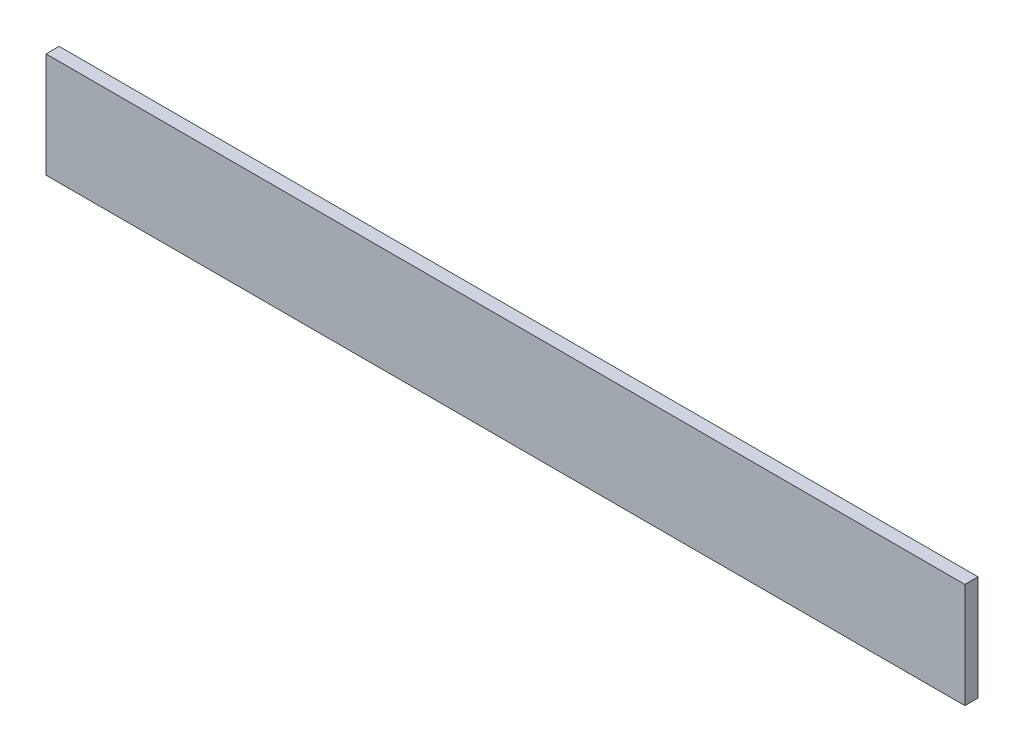
ISO-10303-21;
HEADER;
FILE_DESCRIPTION(('STEP AP214'),'2;1');
FILE_NAME('part.step','',(''),(''),'','','');
FILE_SCHEMA(('AUTOMOTIVE_DESIGN { 1 0 10303 214 1 1 1 1 }'));
ENDSEC;
DATA;
#1=APPLICATION_CONTEXT('core data for automotive mechanical design processes');
#2=APPLICATION_PROTOCOL_DEFINITION('international standard','automotive_design',2000,#1);
#3=PRODUCT_CONTEXT('',#1,'mechanical');
#4=PRODUCT('Part','Part','',(#3));
#5=PRODUCT_RELATED_PRODUCT_CATEGORY('part','',(#4));
#6=PRODUCT_DEFINITION_FORMATION('','',#4);
#7=PRODUCT_DEFINITION_CONTEXT('part definition',#1,'design');
#8=PRODUCT_DEFINITION('design','',#6,#7);
#9=PRODUCT_DEFINITION_SHAPE('','',#8);
#10=(LENGTH_UNIT() NAMED_UNIT(*) SI_UNIT(.MILLI.,.METRE.));
#11=(NAMED_UNIT(*) PLANE_ANGLE_UNIT() SI_UNIT($,.RADIAN.));
#12=(NAMED_UNIT(*) SI_UNIT($,.STERADIAN.) SOLID_ANGLE_UNIT());
#13=UNCERTAINTY_MEASURE_WITH_UNIT(LENGTH_MEASURE(1.E-05),#10,'distance_accuracy_value','');
#14=(GEOMETRIC_REPRESENTATION_CONTEXT(3) GLOBAL_UNCERTAINTY_ASSIGNED_CONTEXT((#13)) GLOBAL_UNIT_ASSIGNED_CONTEXT((#10,
#11,#12)) REPRESENTATION_CONTEXT('',''));
#15=CARTESIAN_POINT('',(0.,0.,0.));
#16=DIRECTION('',(0.,0.,1.));
#17=DIRECTION('',(1.,0.,0.));
#18=AXIS2_PLACEMENT_3D('',#15,#16,#17);
#19=CARTESIAN_POINT('',(175.,20.,5.));
#20=DIRECTION('',(-1.,0.,0.));
#21=DIRECTION('',(0.,0.,1.));
#22=AXIS2_PLACEMENT_3D('',#19,#20,#21);
#23=PLANE('',#22);
#24=DIRECTION('',(0.,1.,0.));
#25=VECTOR('',#24,1.);
#26=CARTESIAN_POINT('',(175.,20.,0.));
#27=LINE('',#26,#25);
#28=CARTESIAN_POINT('',(175.,-20.,0.));
#29=VERTEX_POINT('',#28);
#30=CARTESIAN_POINT('',(175.,20.,0.));
#31=VERTEX_POINT('',#30);
#32=EDGE_CURVE('E107',#29,#31,#27,.T.);
#33=ORIENTED_EDGE('',*,*,#32,.T.);
#34=DIRECTION('',(0.,0.,-1.));
#35=VECTOR('',#34,1.);
#36=CARTESIAN_POINT('',(175.,20.,5.));
#37=LINE('',#36,#35);
#38=CARTESIAN_POINT('',(175.,20.,5.));
#39=VERTEX_POINT('',#38);
#40=EDGE_CURVE('E11',#39,#31,#37,.T.);
#41=ORIENTED_EDGE('',*,*,#40,.F.);
#42=DIRECTION('',(0.,1.,0.));
#43=VECTOR('',#42,1.);
#44=CARTESIAN_POINT('',(175.,20.,5.));
#45=LINE('',#44,#43);
#46=CARTESIAN_POINT('',(175.,-20.,5.));
#47=VERTEX_POINT('',#46);
#48=EDGE_CURVE('E91',#47,#39,#45,.T.);
#49=ORIENTED_EDGE('',*,*,#48,.F.);
#50=DIRECTION('',(0.,0.,-1.));
#51=VECTOR('',#50,1.);
#52=CARTESIAN_POINT('',(175.,-20.,5.));
#53=LINE('',#52,#51);
#54=EDGE_CURVE('E103',#47,#29,#53,.T.);
#55=ORIENTED_EDGE('',*,*,#54,.T.);
#56=EDGE_LOOP('',(#33,#41,#49,#55));
#57=FACE_BOUND('',#56,.T.);
#58=ADVANCED_FACE('F39',(#57),#23,.F.);
#59=CARTESIAN_POINT('',(-175.,20.,5.));
#60=DIRECTION('',(0.,-1.,0.));
#61=DIRECTION('',(0.,0.,-1.));
#62=AXIS2_PLACEMENT_3D('',#59,#60,#61);
#63=PLANE('',#62);
#64=DIRECTION('',(-1.,0.,0.));
#65=VECTOR('',#64,1.);
#66=CARTESIAN_POINT('',(-175.,20.,0.));
#67=LINE('',#66,#65);
#68=CARTESIAN_POINT('',(-175.,20.,0.));
#69=VERTEX_POINT('',#68);
#70=EDGE_CURVE('E96',#31,#69,#67,.T.);
#71=ORIENTED_EDGE('',*,*,#70,.T.);
#72=DIRECTION('',(0.,0.,-1.));
#73=VECTOR('',#72,1.);
#74=CARTESIAN_POINT('',(-175.,20.,5.));
#75=LINE('',#74,#73);
#76=CARTESIAN_POINT('',(-175.,20.,5.));
#77=VERTEX_POINT('',#76);
#78=EDGE_CURVE('E48',#77,#69,#75,.T.);
#79=ORIENTED_EDGE('',*,*,#78,.F.);
#80=DIRECTION('',(-1.,0.,0.));
#81=VECTOR('',#80,1.);
#82=CARTESIAN_POINT('',(-175.,20.,5.));
#83=LINE('',#82,#81);
#84=EDGE_CURVE('E86',#39,#77,#83,.T.);
#85=ORIENTED_EDGE('',*,*,#84,.F.);
#86=ORIENTED_EDGE('',*,*,#40,.T.);
#87=EDGE_LOOP('',(#71,#79,#85,#86));
#88=FACE_BOUND('',#87,.T.);
#89=ADVANCED_FACE('F95',(#88),#63,.F.);
#90=CARTESIAN_POINT('',(-175.,20.,5.));
#91=DIRECTION('',(1.,0.,0.));
#92=DIRECTION('',(0.,0.,-1.));
#93=AXIS2_PLACEMENT_3D('',#90,#91,#92);
#94=PLANE('',#93);
#95=DIRECTION('',(0.,-1.,0.));
#96=VECTOR('',#95,1.);
#97=CARTESIAN_POINT('',(-175.,20.,0.));
#98=LINE('',#97,#96);
#99=CARTESIAN_POINT('',(-175.,-20.,0.));
#100=VERTEX_POINT('',#99);
#101=EDGE_CURVE('E73',#69,#100,#98,.T.);
#102=ORIENTED_EDGE('',*,*,#101,.T.);
#103=DIRECTION('',(0.,0.,-1.));
#104=VECTOR('',#103,1.);
#105=CARTESIAN_POINT('',(-175.,-20.,5.));
#106=LINE('',#105,#104);
#107=CARTESIAN_POINT('',(-175.,-20.,5.));
#108=VERTEX_POINT('',#107);
#109=EDGE_CURVE('E98',#108,#100,#106,.T.);
#110=ORIENTED_EDGE('',*,*,#109,.F.);
#111=DIRECTION('',(0.,-1.,0.));
#112=VECTOR('',#111,1.);
#113=CARTESIAN_POINT('',(-175.,20.,5.));
#114=LINE('',#113,#112);
#115=EDGE_CURVE('E89',#77,#108,#114,.T.);
#116=ORIENTED_EDGE('',*,*,#115,.F.);
#117=ORIENTED_EDGE('',*,*,#78,.T.);
#118=EDGE_LOOP('',(#102,#110,#116,#117));
#119=FACE_BOUND('',#118,.T.);
#120=ADVANCED_FACE('F99',(#119),#94,.F.);
#121=CARTESIAN_POINT('',(-175.,-20.,5.));
#122=DIRECTION('',(0.,1.,0.));
#123=DIRECTION('',(0.,0.,1.));
#124=AXIS2_PLACEMENT_3D('',#121,#122,#123);
#125=PLANE('',#124);
#126=DIRECTION('',(1.,0.,0.));
#127=VECTOR('',#126,1.);
#128=CARTESIAN_POINT('',(-175.,-20.,0.));
#129=LINE('',#128,#127);
#130=EDGE_CURVE('E79',#100,#29,#129,.T.);
#131=ORIENTED_EDGE('',*,*,#130,.T.);
#132=ORIENTED_EDGE('',*,*,#54,.F.);
#133=DIRECTION('',(1.,0.,0.));
#134=VECTOR('',#133,1.);
#135=CARTESIAN_POINT('',(-175.,-20.,5.));
#136=LINE('',#135,#134);
#137=EDGE_CURVE('E56',#108,#47,#136,.T.);
#138=ORIENTED_EDGE('',*,*,#137,.F.);
#139=ORIENTED_EDGE('',*,*,#109,.T.);
#140=EDGE_LOOP('',(#131,#132,#138,#139));
#141=FACE_BOUND('',#140,.T.);
#142=ADVANCED_FACE('F120',(#141),#125,.F.);
#143=CARTESIAN_POINT('',(0.,0.,5.));
#144=DIRECTION('',(0.,0.,1.));
#145=DIRECTION('',(1.,0.,0.));
#146=AXIS2_PLACEMENT_3D('',#143,#144,#145);
#147=PLANE('',#146);
#148=ORIENTED_EDGE('',*,*,#48,.T.);
#149=ORIENTED_EDGE('',*,*,#84,.T.);
#150=ORIENTED_EDGE('',*,*,#115,.T.);
#151=ORIENTED_EDGE('',*,*,#137,.T.);
#152=EDGE_LOOP('',(#148,#149,#150,#151));
#153=FACE_BOUND('',#152,.T.);
#154=ADVANCED_FACE('F87',(#153),#147,.T.);
#155=CARTESIAN_POINT('',(0.,0.,0.));
#156=DIRECTION('',(0.,0.,1.));
#157=DIRECTION('',(1.,0.,0.));
#158=AXIS2_PLACEMENT_3D('',#155,#156,#157);
#159=PLANE('',#158);
#160=ORIENTED_EDGE('',*,*,#32,.F.);
#161=ORIENTED_EDGE('',*,*,#130,.F.);
#162=ORIENTED_EDGE('',*,*,#101,.F.);
#163=ORIENTED_EDGE('',*,*,#70,.F.);
#164=EDGE_LOOP('',(#160,#161,#162,#163));
#165=FACE_BOUND('',#164,.T.);
#166=ADVANCED_FACE('F123',(#165),#159,.F.);
#167=CLOSED_SHELL('',(#58,#89,#120,#142,#154,#166));
#168=MANIFOLD_SOLID_BREP('B2',#167);
#169=ADVANCED_BREP_SHAPE_REPRESENTATION('',(#18,#168),#14);
#170=SHAPE_DEFINITION_REPRESENTATION(#9,#169);
ENDSEC;
END-ISO-10303-21;
